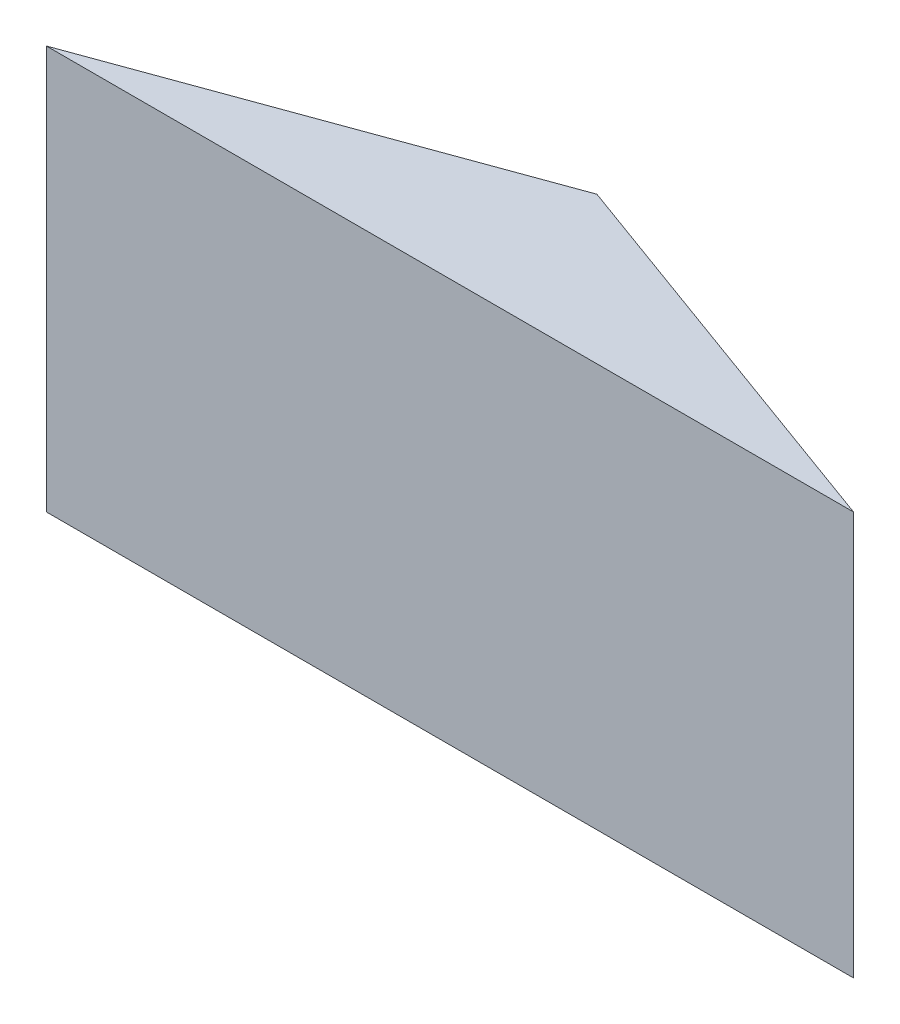
ISO-10303-21;
HEADER;
FILE_DESCRIPTION(('STEP AP214'),'2;1');
FILE_NAME('part.step','',(''),(''),'','','');
FILE_SCHEMA(('AUTOMOTIVE_DESIGN { 1 0 10303 214 1 1 1 1 }'));
ENDSEC;
DATA;
#1=APPLICATION_CONTEXT('core data for automotive mechanical design processes');
#2=APPLICATION_PROTOCOL_DEFINITION('international standard','automotive_design',2000,#1);
#3=PRODUCT_CONTEXT('',#1,'mechanical');
#4=PRODUCT('Part','Part','',(#3));
#5=PRODUCT_RELATED_PRODUCT_CATEGORY('part','',(#4));
#6=PRODUCT_DEFINITION_FORMATION('','',#4);
#7=PRODUCT_DEFINITION_CONTEXT('part definition',#1,'design');
#8=PRODUCT_DEFINITION('design','',#6,#7);
#9=PRODUCT_DEFINITION_SHAPE('','',#8);
#10=(LENGTH_UNIT() NAMED_UNIT(*) SI_UNIT(.MILLI.,.METRE.));
#11=(NAMED_UNIT(*) PLANE_ANGLE_UNIT() SI_UNIT($,.RADIAN.));
#12=(NAMED_UNIT(*) SI_UNIT($,.STERADIAN.) SOLID_ANGLE_UNIT());
#13=UNCERTAINTY_MEASURE_WITH_UNIT(LENGTH_MEASURE(1.E-05),#10,'distance_accuracy_value','');
#14=(GEOMETRIC_REPRESENTATION_CONTEXT(3) GLOBAL_UNCERTAINTY_ASSIGNED_CONTEXT((#13)) GLOBAL_UNIT_ASSIGNED_CONTEXT((#10,
#11,#12)) REPRESENTATION_CONTEXT('',''));
#15=CARTESIAN_POINT('',(0.,0.,0.));
#16=DIRECTION('',(0.,0.,1.));
#17=DIRECTION('',(1.,0.,0.));
#18=AXIS2_PLACEMENT_3D('',#15,#16,#17);
#19=CARTESIAN_POINT('',(0.,20.,0.));
#20=DIRECTION('',(0.,0.,-1.));
#21=DIRECTION('',(-1.,0.,0.));
#22=AXIS2_PLACEMENT_3D('',#19,#20,#21);
#23=PLANE('',#22);
#24=DIRECTION('',(1.,0.,0.));
#25=VECTOR('',#24,1.);
#26=CARTESIAN_POINT('',(0.,0.,0.));
#27=LINE('',#26,#25);
#28=CARTESIAN_POINT('',(-20.,0.,0.));
#29=VERTEX_POINT('',#28);
#30=CARTESIAN_POINT('',(20.,0.,0.));
#31=VERTEX_POINT('',#30);
#32=EDGE_CURVE('E90',#29,#31,#27,.T.);
#33=ORIENTED_EDGE('',*,*,#32,.T.);
#34=DIRECTION('',(0.,-1.,0.));
#35=VECTOR('',#34,1.);
#36=CARTESIAN_POINT('',(20.,20.,0.));
#37=LINE('',#36,#35);
#38=CARTESIAN_POINT('',(20.,20.,0.));
#39=VERTEX_POINT('',#38);
#40=EDGE_CURVE('E11',#39,#31,#37,.T.);
#41=ORIENTED_EDGE('',*,*,#40,.F.);
#42=DIRECTION('',(1.,0.,0.));
#43=VECTOR('',#42,1.);
#44=CARTESIAN_POINT('',(0.,20.,0.));
#45=LINE('',#44,#43);
#46=CARTESIAN_POINT('',(-20.,20.,0.));
#47=VERTEX_POINT('',#46);
#48=EDGE_CURVE('E84',#47,#39,#45,.T.);
#49=ORIENTED_EDGE('',*,*,#48,.F.);
#50=DIRECTION('',(0.,-1.,0.));
#51=VECTOR('',#50,1.);
#52=CARTESIAN_POINT('',(-20.,20.,0.));
#53=LINE('',#52,#51);
#54=EDGE_CURVE('E58',#47,#29,#53,.T.);
#55=ORIENTED_EDGE('',*,*,#54,.T.);
#56=EDGE_LOOP('',(#33,#41,#49,#55));
#57=FACE_BOUND('',#56,.T.);
#58=ADVANCED_FACE('F41',(#57),#23,.F.);
#59=CARTESIAN_POINT('',(2.33955556881014,20.,-6.4278760968653));
#60=DIRECTION('',(-0.342020143325663,0.,0.939692620785911));
#61=DIRECTION('',(0.939692620785911,0.,0.342020143325663));
#62=AXIS2_PLACEMENT_3D('',#59,#60,#61);
#63=PLANE('',#62);
#64=DIRECTION('',(-0.939692620785911,0.,-0.342020143325663));
#65=VECTOR('',#64,1.);
#66=CARTESIAN_POINT('',(2.33955556881014,0.,-6.4278760968653));
#67=LINE('',#66,#65);
#68=CARTESIAN_POINT('',(0.,0.,-7.27940468532391));
#69=VERTEX_POINT('',#68);
#70=EDGE_CURVE('E94',#31,#69,#67,.T.);
#71=ORIENTED_EDGE('',*,*,#70,.T.);
#72=DIRECTION('',(0.,-1.,0.));
#73=VECTOR('',#72,1.);
#74=CARTESIAN_POINT('',(0.,20.,-7.27940468532391));
#75=LINE('',#74,#73);
#76=CARTESIAN_POINT('',(0.,20.,-7.27940468532391));
#77=VERTEX_POINT('',#76);
#78=EDGE_CURVE('E50',#77,#69,#75,.T.);
#79=ORIENTED_EDGE('',*,*,#78,.F.);
#80=DIRECTION('',(-0.939692620785911,0.,-0.342020143325663));
#81=VECTOR('',#80,1.);
#82=CARTESIAN_POINT('',(2.33955556881014,20.,-6.4278760968653));
#83=LINE('',#82,#81);
#84=EDGE_CURVE('E76',#39,#77,#83,.T.);
#85=ORIENTED_EDGE('',*,*,#84,.F.);
#86=ORIENTED_EDGE('',*,*,#40,.T.);
#87=EDGE_LOOP('',(#71,#79,#85,#86));
#88=FACE_BOUND('',#87,.T.);
#89=ADVANCED_FACE('F78',(#88),#63,.F.);
#90=CARTESIAN_POINT('',(-2.33955556881014,20.,-6.4278760968653));
#91=DIRECTION('',(-0.342020143325663,0.,-0.93969262078591));
#92=DIRECTION('',(-0.939692620785911,0.,0.342020143325663));
#93=AXIS2_PLACEMENT_3D('',#90,#91,#92);
#94=PLANE('',#93);
#95=DIRECTION('',(0.939692620785911,0.,-0.342020143325663));
#96=VECTOR('',#95,1.);
#97=CARTESIAN_POINT('',(-2.33955556881014,0.,-6.4278760968653));
#98=LINE('',#97,#96);
#99=EDGE_CURVE('E88',#29,#69,#98,.T.);
#100=ORIENTED_EDGE('',*,*,#99,.F.);
#101=ORIENTED_EDGE('',*,*,#54,.F.);
#102=DIRECTION('',(0.939692620785911,0.,-0.342020143325663));
#103=VECTOR('',#102,1.);
#104=CARTESIAN_POINT('',(-2.33955556881014,20.,-6.4278760968653));
#105=LINE('',#104,#103);
#106=EDGE_CURVE('E83',#47,#77,#105,.T.);
#107=ORIENTED_EDGE('',*,*,#106,.T.);
#108=ORIENTED_EDGE('',*,*,#78,.T.);
#109=EDGE_LOOP('',(#100,#101,#107,#108));
#110=FACE_BOUND('',#109,.T.);
#111=ADVANCED_FACE('F105',(#110),#94,.T.);
#112=CARTESIAN_POINT('',(0.,20.,0.));
#113=DIRECTION('',(0.,1.,0.));
#114=DIRECTION('',(0.,0.,1.));
#115=AXIS2_PLACEMENT_3D('',#112,#113,#114);
#116=PLANE('',#115);
#117=ORIENTED_EDGE('',*,*,#48,.T.);
#118=ORIENTED_EDGE('',*,*,#84,.T.);
#119=ORIENTED_EDGE('',*,*,#106,.F.);
#120=EDGE_LOOP('',(#117,#118,#119));
#121=FACE_BOUND('',#120,.T.);
#122=ADVANCED_FACE('F86',(#121),#116,.T.);
#123=CARTESIAN_POINT('',(0.,0.,0.));
#124=DIRECTION('',(0.,1.,0.));
#125=DIRECTION('',(0.,0.,1.));
#126=AXIS2_PLACEMENT_3D('',#123,#124,#125);
#127=PLANE('',#126);
#128=ORIENTED_EDGE('',*,*,#32,.F.);
#129=ORIENTED_EDGE('',*,*,#99,.T.);
#130=ORIENTED_EDGE('',*,*,#70,.F.);
#131=EDGE_LOOP('',(#128,#129,#130));
#132=FACE_BOUND('',#131,.T.);
#133=ADVANCED_FACE('F112',(#132),#127,.F.);
#134=CLOSED_SHELL('',(#58,#89,#111,#122,#133));
#135=MANIFOLD_SOLID_BREP('B2',#134);
#136=ADVANCED_BREP_SHAPE_REPRESENTATION('',(#18,#135),#14);
#137=SHAPE_DEFINITION_REPRESENTATION(#9,#136);
ENDSEC;
END-ISO-10303-21;
